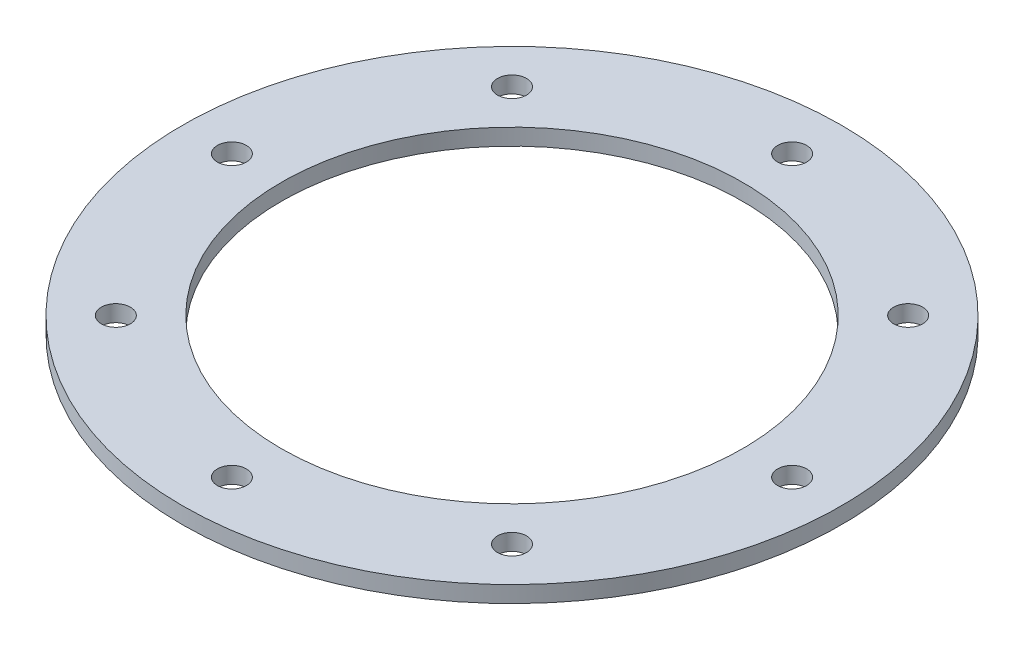
ISO-10303-21;
HEADER;
FILE_DESCRIPTION(('STEP AP214'),'2;1');
FILE_NAME('part.step','',(''),(''),'','','');
FILE_SCHEMA(('AUTOMOTIVE_DESIGN { 1 0 10303 214 1 1 1 1 }'));
ENDSEC;
DATA;
#1=APPLICATION_CONTEXT('core data for automotive mechanical design processes');
#2=APPLICATION_PROTOCOL_DEFINITION('international standard','automotive_design',2000,#1);
#3=PRODUCT_CONTEXT('',#1,'mechanical');
#4=PRODUCT('Part','Part','',(#3));
#5=PRODUCT_RELATED_PRODUCT_CATEGORY('part','',(#4));
#6=PRODUCT_DEFINITION_FORMATION('','',#4);
#7=PRODUCT_DEFINITION_CONTEXT('part definition',#1,'design');
#8=PRODUCT_DEFINITION('design','',#6,#7);
#9=PRODUCT_DEFINITION_SHAPE('','',#8);
#10=(LENGTH_UNIT() NAMED_UNIT(*) SI_UNIT(.MILLI.,.METRE.));
#11=(NAMED_UNIT(*) PLANE_ANGLE_UNIT() SI_UNIT($,.RADIAN.));
#12=(NAMED_UNIT(*) SI_UNIT($,.STERADIAN.) SOLID_ANGLE_UNIT());
#13=UNCERTAINTY_MEASURE_WITH_UNIT(LENGTH_MEASURE(1.E-05),#10,'distance_accuracy_value','');
#14=(GEOMETRIC_REPRESENTATION_CONTEXT(3) GLOBAL_UNCERTAINTY_ASSIGNED_CONTEXT((#13)) GLOBAL_UNIT_ASSIGNED_CONTEXT((#10,
#11,#12)) REPRESENTATION_CONTEXT('',''));
#15=CARTESIAN_POINT('',(0.,0.,0.));
#16=DIRECTION('',(0.,0.,1.));
#17=DIRECTION('',(1.,0.,0.));
#18=AXIS2_PLACEMENT_3D('',#15,#16,#17);
#19=CARTESIAN_POINT('',(0.,4.99999999999989,2.22044604925031E-13));
#20=DIRECTION('',(0.,1.,0.));
#21=DIRECTION('',(0.,0.,1.));
#22=AXIS2_PLACEMENT_3D('',#19,#20,#21);
#23=PLANE('',#22);
#24=CARTESIAN_POINT('',(0.,5.00000000000073,-84.9999999999999));
#25=DIRECTION('',(0.,1.,0.));
#26=DIRECTION('',(0.,0.,1.));
#27=AXIS2_PLACEMENT_3D('',#24,#25,#26);
#28=CIRCLE('',#27,4.4);
#29=CARTESIAN_POINT('',(0.,5.00000000000073,-80.5999999999999));
#30=VERTEX_POINT('',#29);
#31=EDGE_CURVE('E109',#30,#30,#28,.T.);
#32=ORIENTED_EDGE('',*,*,#31,.F.);
#33=EDGE_LOOP('',(#32));
#34=FACE_BOUND('',#33,.T.);
#35=CARTESIAN_POINT('',(-85.,4.99999999999989,2.22044604925031E-13));
#36=DIRECTION('',(0.,1.,0.));
#37=DIRECTION('',(0.,0.,1.));
#38=AXIS2_PLACEMENT_3D('',#35,#36,#37);
#39=CIRCLE('',#38,4.4);
#40=CARTESIAN_POINT('',(-85.,4.99999999999989,4.40000000000022));
#41=VERTEX_POINT('',#40);
#42=EDGE_CURVE('E93',#41,#41,#39,.T.);
#43=ORIENTED_EDGE('',*,*,#42,.F.);
#44=EDGE_LOOP('',(#43));
#45=FACE_BOUND('',#44,.T.);
#46=CARTESIAN_POINT('',(0.,4.99999999999989,85.0000000000001));
#47=DIRECTION('',(0.,1.,0.));
#48=DIRECTION('',(0.,0.,1.));
#49=AXIS2_PLACEMENT_3D('',#46,#47,#48);
#50=CIRCLE('',#49,4.4);
#51=CARTESIAN_POINT('',(0.,4.99999999999989,89.4000000000001));
#52=VERTEX_POINT('',#51);
#53=EDGE_CURVE('E77',#52,#52,#50,.T.);
#54=ORIENTED_EDGE('',*,*,#53,.F.);
#55=EDGE_LOOP('',(#54));
#56=FACE_BOUND('',#55,.T.);
#57=CARTESIAN_POINT('',(85.,4.99999999999989,2.22044604925031E-13));
#58=DIRECTION('',(0.,1.,0.));
#59=DIRECTION('',(0.,0.,1.));
#60=AXIS2_PLACEMENT_3D('',#57,#58,#59);
#61=CIRCLE('',#60,4.4);
#62=CARTESIAN_POINT('',(85.,4.99999999999989,4.40000000000022));
#63=VERTEX_POINT('',#62);
#64=EDGE_CURVE('E61',#63,#63,#61,.T.);
#65=ORIENTED_EDGE('',*,*,#64,.F.);
#66=EDGE_LOOP('',(#65));
#67=FACE_BOUND('',#66,.T.);
#68=CARTESIAN_POINT('',(0.,4.99999999999989,2.22044604925031E-13));
#69=DIRECTION('',(0.,1.,0.));
#70=DIRECTION('',(0.,0.,1.));
#71=AXIS2_PLACEMENT_3D('',#68,#69,#70);
#72=CIRCLE('',#71,100.);
#73=CARTESIAN_POINT('',(0.,4.9999999999999,100.));
#74=VERTEX_POINT('',#73);
#75=EDGE_CURVE('E10',#74,#74,#72,.T.);
#76=ORIENTED_EDGE('',*,*,#75,.T.);
#77=EDGE_LOOP('',(#76));
#78=FACE_BOUND('',#77,.T.);
#79=CARTESIAN_POINT('',(0.,4.99999999999989,2.22044604925031E-13));
#80=DIRECTION('',(0.,1.,0.));
#81=DIRECTION('',(0.,0.,1.));
#82=AXIS2_PLACEMENT_3D('',#79,#80,#81);
#83=CIRCLE('',#82,70.);
#84=CARTESIAN_POINT('',(0.,4.9999999999999,70.0000000000003));
#85=VERTEX_POINT('',#84);
#86=EDGE_CURVE('E55',#85,#85,#83,.T.);
#87=ORIENTED_EDGE('',*,*,#86,.F.);
#88=EDGE_LOOP('',(#87));
#89=FACE_BOUND('',#88,.T.);
#90=CARTESIAN_POINT('',(60.1040764008565,4.99999999999989,60.1040764008565));
#91=DIRECTION('',(0.,1.,0.));
#92=DIRECTION('',(0.,0.,1.));
#93=AXIS2_PLACEMENT_3D('',#90,#91,#92);
#94=CIRCLE('',#93,4.4);
#95=CARTESIAN_POINT('',(60.1040764008565,4.99999999999989,64.5040764008565));
#96=VERTEX_POINT('',#95);
#97=EDGE_CURVE('E69',#96,#96,#94,.T.);
#98=ORIENTED_EDGE('',*,*,#97,.F.);
#99=EDGE_LOOP('',(#98));
#100=FACE_BOUND('',#99,.T.);
#101=CARTESIAN_POINT('',(-60.1040764008565,4.99999999999989,60.1040764008565));
#102=DIRECTION('',(0.,1.,0.));
#103=DIRECTION('',(0.,0.,1.));
#104=AXIS2_PLACEMENT_3D('',#101,#102,#103);
#105=CIRCLE('',#104,4.4);
#106=CARTESIAN_POINT('',(-60.1040764008565,4.99999999999989,64.5040764008565));
#107=VERTEX_POINT('',#106);
#108=EDGE_CURVE('E85',#107,#107,#105,.T.);
#109=ORIENTED_EDGE('',*,*,#108,.F.);
#110=EDGE_LOOP('',(#109));
#111=FACE_BOUND('',#110,.T.);
#112=CARTESIAN_POINT('',(-60.1040764008565,5.00000000000078,-60.1040764008566));
#113=DIRECTION('',(0.,1.,0.));
#114=DIRECTION('',(0.,0.,1.));
#115=AXIS2_PLACEMENT_3D('',#112,#113,#114);
#116=CIRCLE('',#115,4.4);
#117=CARTESIAN_POINT('',(-60.1040764008565,5.00000000000078,-55.7040764008566));
#118=VERTEX_POINT('',#117);
#119=EDGE_CURVE('E101',#118,#118,#116,.T.);
#120=ORIENTED_EDGE('',*,*,#119,.F.);
#121=EDGE_LOOP('',(#120));
#122=FACE_BOUND('',#121,.T.);
#123=CARTESIAN_POINT('',(60.1040764008565,5.00000000000078,-60.1040764008566));
#124=DIRECTION('',(0.,1.,0.));
#125=DIRECTION('',(0.,0.,1.));
#126=AXIS2_PLACEMENT_3D('',#123,#124,#125);
#127=CIRCLE('',#126,4.4);
#128=CARTESIAN_POINT('',(60.1040764008565,5.00000000000078,-55.7040764008566));
#129=VERTEX_POINT('',#128);
#130=EDGE_CURVE('E117',#129,#129,#127,.T.);
#131=ORIENTED_EDGE('',*,*,#130,.F.);
#132=EDGE_LOOP('',(#131));
#133=FACE_BOUND('',#132,.T.);
#134=ADVANCED_FACE('F41',(#34,#45,#56,#67,#78,#89,#100,#111,#122,#133),#23,.T.);
#135=CARTESIAN_POINT('',(0.,0.,0.));
#136=DIRECTION('',(0.,1.,0.));
#137=DIRECTION('',(0.,0.,1.));
#138=AXIS2_PLACEMENT_3D('',#135,#136,#137);
#139=PLANE('',#138);
#140=CARTESIAN_POINT('',(0.,0.,0.));
#141=DIRECTION('',(0.,1.,0.));
#142=DIRECTION('',(0.,0.,1.));
#143=AXIS2_PLACEMENT_3D('',#140,#141,#142);
#144=CIRCLE('',#143,100.);
#145=CARTESIAN_POINT('',(0.,0.,100.));
#146=VERTEX_POINT('',#145);
#147=EDGE_CURVE('E45',#146,#146,#144,.T.);
#148=ORIENTED_EDGE('',*,*,#147,.F.);
#149=EDGE_LOOP('',(#148));
#150=FACE_BOUND('',#149,.T.);
#151=CARTESIAN_POINT('',(0.,0.,0.));
#152=DIRECTION('',(0.,1.,0.));
#153=DIRECTION('',(0.,0.,1.));
#154=AXIS2_PLACEMENT_3D('',#151,#152,#153);
#155=CIRCLE('',#154,70.);
#156=CARTESIAN_POINT('',(0.,0.,70.));
#157=VERTEX_POINT('',#156);
#158=EDGE_CURVE('E57',#157,#157,#155,.T.);
#159=ORIENTED_EDGE('',*,*,#158,.T.);
#160=EDGE_LOOP('',(#159));
#161=FACE_BOUND('',#160,.T.);
#162=CARTESIAN_POINT('',(85.,0.,0.));
#163=DIRECTION('',(0.,1.,0.));
#164=DIRECTION('',(0.,0.,1.));
#165=AXIS2_PLACEMENT_3D('',#162,#163,#164);
#166=CIRCLE('',#165,4.4);
#167=CARTESIAN_POINT('',(85.,0.,4.4));
#168=VERTEX_POINT('',#167);
#169=EDGE_CURVE('E65',#168,#168,#166,.T.);
#170=ORIENTED_EDGE('',*,*,#169,.T.);
#171=EDGE_LOOP('',(#170));
#172=FACE_BOUND('',#171,.T.);
#173=CARTESIAN_POINT('',(60.1040764008565,0.,60.1040764008568));
#174=DIRECTION('',(0.,1.,0.));
#175=DIRECTION('',(0.,0.,1.));
#176=AXIS2_PLACEMENT_3D('',#173,#174,#175);
#177=CIRCLE('',#176,4.4);
#178=CARTESIAN_POINT('',(60.1040764008565,0.,64.5040764008568));
#179=VERTEX_POINT('',#178);
#180=EDGE_CURVE('E73',#179,#179,#177,.T.);
#181=ORIENTED_EDGE('',*,*,#180,.T.);
#182=EDGE_LOOP('',(#181));
#183=FACE_BOUND('',#182,.T.);
#184=CARTESIAN_POINT('',(0.,0.,85.0000000000006));
#185=DIRECTION('',(0.,1.,0.));
#186=DIRECTION('',(0.,0.,1.));
#187=AXIS2_PLACEMENT_3D('',#184,#185,#186);
#188=CIRCLE('',#187,4.4);
#189=CARTESIAN_POINT('',(0.,0.,89.4000000000006));
#190=VERTEX_POINT('',#189);
#191=EDGE_CURVE('E81',#190,#190,#188,.T.);
#192=ORIENTED_EDGE('',*,*,#191,.T.);
#193=EDGE_LOOP('',(#192));
#194=FACE_BOUND('',#193,.T.);
#195=CARTESIAN_POINT('',(-60.1040764008565,0.,60.1040764008568));
#196=DIRECTION('',(0.,1.,0.));
#197=DIRECTION('',(0.,0.,1.));
#198=AXIS2_PLACEMENT_3D('',#195,#196,#197);
#199=CIRCLE('',#198,4.4);
#200=CARTESIAN_POINT('',(-60.1040764008565,0.,64.5040764008568));
#201=VERTEX_POINT('',#200);
#202=EDGE_CURVE('E89',#201,#201,#199,.T.);
#203=ORIENTED_EDGE('',*,*,#202,.T.);
#204=EDGE_LOOP('',(#203));
#205=FACE_BOUND('',#204,.T.);
#206=CARTESIAN_POINT('',(-85.,0.,0.));
#207=DIRECTION('',(0.,1.,0.));
#208=DIRECTION('',(0.,0.,1.));
#209=AXIS2_PLACEMENT_3D('',#206,#207,#208);
#210=CIRCLE('',#209,4.4);
#211=CARTESIAN_POINT('',(-85.,0.,4.4));
#212=VERTEX_POINT('',#211);
#213=EDGE_CURVE('E97',#212,#212,#210,.T.);
#214=ORIENTED_EDGE('',*,*,#213,.T.);
#215=EDGE_LOOP('',(#214));
#216=FACE_BOUND('',#215,.T.);
#217=CARTESIAN_POINT('',(-60.1040764008565,0.,-60.1040764008565));
#218=DIRECTION('',(0.,1.,0.));
#219=DIRECTION('',(0.,0.,1.));
#220=AXIS2_PLACEMENT_3D('',#217,#218,#219);
#221=CIRCLE('',#220,4.4);
#222=CARTESIAN_POINT('',(-60.1040764008565,0.,-55.7040764008565));
#223=VERTEX_POINT('',#222);
#224=EDGE_CURVE('E105',#223,#223,#221,.T.);
#225=ORIENTED_EDGE('',*,*,#224,.T.);
#226=EDGE_LOOP('',(#225));
#227=FACE_BOUND('',#226,.T.);
#228=CARTESIAN_POINT('',(0.,0.,-85.));
#229=DIRECTION('',(0.,1.,0.));
#230=DIRECTION('',(0.,0.,1.));
#231=AXIS2_PLACEMENT_3D('',#228,#229,#230);
#232=CIRCLE('',#231,4.4);
#233=CARTESIAN_POINT('',(0.,0.,-80.6));
#234=VERTEX_POINT('',#233);
#235=EDGE_CURVE('E113',#234,#234,#232,.T.);
#236=ORIENTED_EDGE('',*,*,#235,.T.);
#237=EDGE_LOOP('',(#236));
#238=FACE_BOUND('',#237,.T.);
#239=CARTESIAN_POINT('',(60.1040764008565,0.,-60.1040764008565));
#240=DIRECTION('',(0.,1.,0.));
#241=DIRECTION('',(0.,0.,1.));
#242=AXIS2_PLACEMENT_3D('',#239,#240,#241);
#243=CIRCLE('',#242,4.4);
#244=CARTESIAN_POINT('',(60.1040764008565,0.,-55.7040764008565));
#245=VERTEX_POINT('',#244);
#246=EDGE_CURVE('E121',#245,#245,#243,.T.);
#247=ORIENTED_EDGE('',*,*,#246,.T.);
#248=EDGE_LOOP('',(#247));
#249=FACE_BOUND('',#248,.T.);
#250=ADVANCED_FACE('F134',(#150,#161,#172,#183,#194,#205,#216,#227,#238,#249),#139,.F.);
#251=CARTESIAN_POINT('',(0.,4.99999999999989,2.22044604925031E-13));
#252=DIRECTION('',(0.,-1.,0.));
#253=DIRECTION('',(0.,0.,-1.));
#254=AXIS2_PLACEMENT_3D('',#251,#252,#253);
#255=CYLINDRICAL_SURFACE('',#254,100.);
#256=ORIENTED_EDGE('',*,*,#75,.F.);
#257=EDGE_LOOP('',(#256));
#258=FACE_BOUND('',#257,.T.);
#259=ORIENTED_EDGE('',*,*,#147,.T.);
#260=EDGE_LOOP('',(#259));
#261=FACE_BOUND('',#260,.T.);
#262=ADVANCED_FACE('F43',(#258,#261),#255,.T.);
#263=CARTESIAN_POINT('',(0.,4.99999999999989,2.22044604925031E-13));
#264=DIRECTION('',(0.,-1.,0.));
#265=DIRECTION('',(0.,0.,-1.));
#266=AXIS2_PLACEMENT_3D('',#263,#264,#265);
#267=CYLINDRICAL_SURFACE('',#266,70.);
#268=ORIENTED_EDGE('',*,*,#86,.T.);
#269=EDGE_LOOP('',(#268));
#270=FACE_BOUND('',#269,.T.);
#271=ORIENTED_EDGE('',*,*,#158,.F.);
#272=EDGE_LOOP('',(#271));
#273=FACE_BOUND('',#272,.T.);
#274=ADVANCED_FACE('F144',(#270,#273),#267,.F.);
#275=CARTESIAN_POINT('',(85.,4.99999999999989,2.22044604925031E-13));
#276=DIRECTION('',(0.,-1.,0.));
#277=DIRECTION('',(0.,0.,-1.));
#278=AXIS2_PLACEMENT_3D('',#275,#276,#277);
#279=CYLINDRICAL_SURFACE('',#278,4.4);
#280=ORIENTED_EDGE('',*,*,#64,.T.);
#281=EDGE_LOOP('',(#280));
#282=FACE_BOUND('',#281,.T.);
#283=ORIENTED_EDGE('',*,*,#169,.F.);
#284=EDGE_LOOP('',(#283));
#285=FACE_BOUND('',#284,.T.);
#286=ADVANCED_FACE('F147',(#282,#285),#279,.F.);
#287=CARTESIAN_POINT('',(60.1040764008565,4.99999999999989,60.1040764008565));
#288=DIRECTION('',(0.,-1.,0.));
#289=DIRECTION('',(0.,0.,-1.));
#290=AXIS2_PLACEMENT_3D('',#287,#288,#289);
#291=CYLINDRICAL_SURFACE('',#290,4.4);
#292=ORIENTED_EDGE('',*,*,#97,.T.);
#293=EDGE_LOOP('',(#292));
#294=FACE_BOUND('',#293,.T.);
#295=ORIENTED_EDGE('',*,*,#180,.F.);
#296=EDGE_LOOP('',(#295));
#297=FACE_BOUND('',#296,.T.);
#298=ADVANCED_FACE('F151',(#294,#297),#291,.F.);
#299=CARTESIAN_POINT('',(0.,4.99999999999989,85.0000000000001));
#300=DIRECTION('',(0.,-1.,0.));
#301=DIRECTION('',(0.,0.,-1.));
#302=AXIS2_PLACEMENT_3D('',#299,#300,#301);
#303=CYLINDRICAL_SURFACE('',#302,4.4);
#304=ORIENTED_EDGE('',*,*,#53,.T.);
#305=EDGE_LOOP('',(#304));
#306=FACE_BOUND('',#305,.T.);
#307=ORIENTED_EDGE('',*,*,#191,.F.);
#308=EDGE_LOOP('',(#307));
#309=FACE_BOUND('',#308,.T.);
#310=ADVANCED_FACE('F155',(#306,#309),#303,.F.);
#311=CARTESIAN_POINT('',(-60.1040764008565,4.99999999999989,60.1040764008565));
#312=DIRECTION('',(0.,-1.,0.));
#313=DIRECTION('',(0.,0.,-1.));
#314=AXIS2_PLACEMENT_3D('',#311,#312,#313);
#315=CYLINDRICAL_SURFACE('',#314,4.4);
#316=ORIENTED_EDGE('',*,*,#108,.T.);
#317=EDGE_LOOP('',(#316));
#318=FACE_BOUND('',#317,.T.);
#319=ORIENTED_EDGE('',*,*,#202,.F.);
#320=EDGE_LOOP('',(#319));
#321=FACE_BOUND('',#320,.T.);
#322=ADVANCED_FACE('F159',(#318,#321),#315,.F.);
#323=CARTESIAN_POINT('',(-85.,4.99999999999989,2.22044604925031E-13));
#324=DIRECTION('',(0.,-1.,0.));
#325=DIRECTION('',(0.,0.,-1.));
#326=AXIS2_PLACEMENT_3D('',#323,#324,#325);
#327=CYLINDRICAL_SURFACE('',#326,4.4);
#328=ORIENTED_EDGE('',*,*,#42,.T.);
#329=EDGE_LOOP('',(#328));
#330=FACE_BOUND('',#329,.T.);
#331=ORIENTED_EDGE('',*,*,#213,.F.);
#332=EDGE_LOOP('',(#331));
#333=FACE_BOUND('',#332,.T.);
#334=ADVANCED_FACE('F163',(#330,#333),#327,.F.);
#335=CARTESIAN_POINT('',(-60.1040764008565,5.00000000000078,-60.1040764008566));
#336=DIRECTION('',(0.,-1.,0.));
#337=DIRECTION('',(0.,0.,-1.));
#338=AXIS2_PLACEMENT_3D('',#335,#336,#337);
#339=CYLINDRICAL_SURFACE('',#338,4.4);
#340=ORIENTED_EDGE('',*,*,#119,.T.);
#341=EDGE_LOOP('',(#340));
#342=FACE_BOUND('',#341,.T.);
#343=ORIENTED_EDGE('',*,*,#224,.F.);
#344=EDGE_LOOP('',(#343));
#345=FACE_BOUND('',#344,.T.);
#346=ADVANCED_FACE('F167',(#342,#345),#339,.F.);
#347=CARTESIAN_POINT('',(0.,5.00000000000073,-84.9999999999999));
#348=DIRECTION('',(0.,-1.,0.));
#349=DIRECTION('',(0.,0.,-1.));
#350=AXIS2_PLACEMENT_3D('',#347,#348,#349);
#351=CYLINDRICAL_SURFACE('',#350,4.4);
#352=ORIENTED_EDGE('',*,*,#31,.T.);
#353=EDGE_LOOP('',(#352));
#354=FACE_BOUND('',#353,.T.);
#355=ORIENTED_EDGE('',*,*,#235,.F.);
#356=EDGE_LOOP('',(#355));
#357=FACE_BOUND('',#356,.T.);
#358=ADVANCED_FACE('F171',(#354,#357),#351,.F.);
#359=CARTESIAN_POINT('',(60.1040764008565,5.00000000000078,-60.1040764008566));
#360=DIRECTION('',(0.,-1.,0.));
#361=DIRECTION('',(0.,0.,-1.));
#362=AXIS2_PLACEMENT_3D('',#359,#360,#361);
#363=CYLINDRICAL_SURFACE('',#362,4.4);
#364=ORIENTED_EDGE('',*,*,#130,.T.);
#365=EDGE_LOOP('',(#364));
#366=FACE_BOUND('',#365,.T.);
#367=ORIENTED_EDGE('',*,*,#246,.F.);
#368=EDGE_LOOP('',(#367));
#369=FACE_BOUND('',#368,.T.);
#370=ADVANCED_FACE('F130',(#366,#369),#363,.F.);
#371=CLOSED_SHELL('',(#134,#250,#262,#274,#286,#298,#310,#322,#334,#346,#358,#370));
#372=MANIFOLD_SOLID_BREP('B2',#371);
#373=ADVANCED_BREP_SHAPE_REPRESENTATION('',(#18,#372),#14);
#374=SHAPE_DEFINITION_REPRESENTATION(#9,#373);
ENDSEC;
END-ISO-10303-21;
